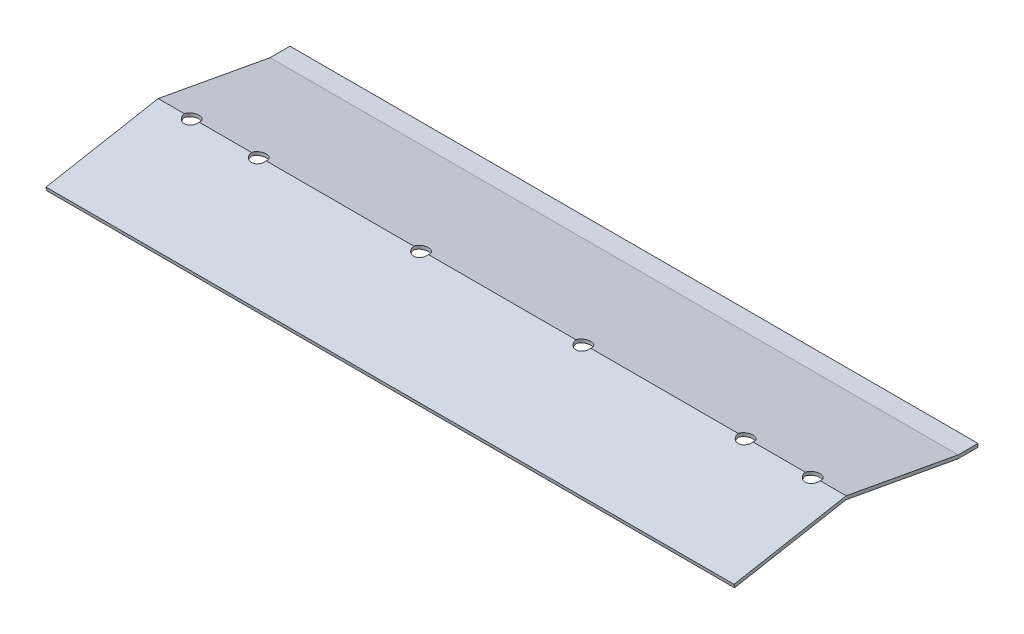
ISO-10303-21;
HEADER;
FILE_DESCRIPTION(('STEP AP214'),'2;1');
FILE_NAME('part.step','',(''),(''),'','','');
FILE_SCHEMA(('AUTOMOTIVE_DESIGN { 1 0 10303 214 1 1 1 1 }'));
ENDSEC;
DATA;
#1=APPLICATION_CONTEXT('core data for automotive mechanical design processes');
#2=APPLICATION_PROTOCOL_DEFINITION('international standard','automotive_design',2000,#1);
#3=PRODUCT_CONTEXT('',#1,'mechanical');
#4=PRODUCT('Part','Part','',(#3));
#5=PRODUCT_RELATED_PRODUCT_CATEGORY('part','',(#4));
#6=PRODUCT_DEFINITION_FORMATION('','',#4);
#7=PRODUCT_DEFINITION_CONTEXT('part definition',#1,'design');
#8=PRODUCT_DEFINITION('design','',#6,#7);
#9=PRODUCT_DEFINITION_SHAPE('','',#8);
#10=(LENGTH_UNIT() NAMED_UNIT(*) SI_UNIT(.MILLI.,.METRE.));
#11=(NAMED_UNIT(*) PLANE_ANGLE_UNIT() SI_UNIT($,.RADIAN.));
#12=(NAMED_UNIT(*) SI_UNIT($,.STERADIAN.) SOLID_ANGLE_UNIT());
#13=UNCERTAINTY_MEASURE_WITH_UNIT(LENGTH_MEASURE(1.E-05),#10,'distance_accuracy_value','');
#14=(GEOMETRIC_REPRESENTATION_CONTEXT(3) GLOBAL_UNCERTAINTY_ASSIGNED_CONTEXT((#13)) GLOBAL_UNIT_ASSIGNED_CONTEXT((#10,
#11,#12)) REPRESENTATION_CONTEXT('',''));
#15=CARTESIAN_POINT('',(0.,0.,0.));
#16=DIRECTION('',(0.,0.,1.));
#17=DIRECTION('',(1.,0.,0.));
#18=AXIS2_PLACEMENT_3D('',#15,#16,#17);
#19=CARTESIAN_POINT('',(1026.,-1243.62389600676,5648.33058655087));
#20=DIRECTION('',(0.,0.161662198391354,-0.986846154986315));
#21=DIRECTION('',(0.,0.986846154986315,0.161662198391354));
#22=AXIS2_PLACEMENT_3D('',#19,#20,#21);
#23=PLANE('',#22);
#24=DIRECTION('',(0.,-0.986846154986315,-0.161662198391354));
#25=VECTOR('',#24,1.);
#26=CARTESIAN_POINT('',(0.,-1243.62389600676,5648.33058655087));
#27=LINE('',#26,#25);
#28=CARTESIAN_POINT('',(0.,-1238.68966523183,5649.13889754283));
#29=VERTEX_POINT('',#28);
#30=CARTESIAN_POINT('',(0.,-1243.62389600676,5648.33058655087));
#31=VERTEX_POINT('',#30);
#32=EDGE_CURVE('E255',#29,#31,#27,.T.);
#33=ORIENTED_EDGE('',*,*,#32,.T.);
#34=DIRECTION('',(-1.,0.,0.));
#35=VECTOR('',#34,1.);
#36=CARTESIAN_POINT('',(1026.,-1243.62389600676,5648.33058655087));
#37=LINE('',#36,#35);
#38=CARTESIAN_POINT('',(1026.,-1243.62389600676,5648.33058655087));
#39=VERTEX_POINT('',#38);
#40=EDGE_CURVE('E178',#39,#31,#37,.T.);
#41=ORIENTED_EDGE('',*,*,#40,.F.);
#42=DIRECTION('',(0.,-0.986846154986315,-0.161662198391354));
#43=VECTOR('',#42,1.);
#44=CARTESIAN_POINT('',(1026.,-1243.62389600676,5648.33058655087));
#45=LINE('',#44,#43);
#46=CARTESIAN_POINT('',(1026.,-1238.68966523183,5649.13889754283));
#47=VERTEX_POINT('',#46);
#48=EDGE_CURVE('E270',#47,#39,#45,.T.);
#49=ORIENTED_EDGE('',*,*,#48,.F.);
#50=DIRECTION('',(-1.,0.,0.));
#51=VECTOR('',#50,1.);
#52=CARTESIAN_POINT('',(1026.,-1238.68966523183,5649.13889754283));
#53=LINE('',#52,#51);
#54=EDGE_CURVE('E203',#47,#29,#53,.T.);
#55=ORIENTED_EDGE('',*,*,#54,.T.);
#56=EDGE_LOOP('',(#33,#41,#49,#55));
#57=FACE_BOUND('',#56,.T.);
#58=ADVANCED_FACE('F33',(#57),#23,.F.);
#59=CARTESIAN_POINT('',(1026.,-1213.07202138308,5481.83058655087));
#60=DIRECTION('',(0.,0.983578386114327,0.180481462673418));
#61=DIRECTION('',(0.,-0.180481462673418,0.983578386114327));
#62=AXIS2_PLACEMENT_3D('',#59,#60,#61);
#63=PLANE('',#62);
#64=DIRECTION('',(-1.,0.,0.));
#65=VECTOR('',#64,1.);
#66=CARTESIAN_POINT('',(1026.,-1213.07202138308,5481.83058655087));
#67=LINE('',#66,#65);
#68=CARTESIAN_POINT('',(39.0000000000006,-1213.07202138308,5481.83058655087));
#69=VERTEX_POINT('',#68);
#70=CARTESIAN_POINT('',(0.,-1213.07202138308,5481.83058655087));
#71=VERTEX_POINT('',#70);
#72=EDGE_CURVE('E216',#69,#71,#67,.T.);
#73=ORIENTED_EDGE('',*,*,#72,.F.);
#74=CARTESIAN_POINT('',(50.,-1213.07202138308,5481.83058655087));
#75=DIRECTION('',(0.,0.983578386114327,0.180481462673418));
#76=DIRECTION('',(0.,0.180481462673418,-0.983578386114327));
#77=AXIS2_PLACEMENT_3D('',#74,#75,#76);
#78=ELLIPSE('',#77,11.1836536419389,10.9999999999999);
#79=CARTESIAN_POINT('',(61.0000000000004,-1213.07202138308,5481.83058655087));
#80=VERTEX_POINT('',#79);
#81=EDGE_CURVE('E46',#69,#80,#78,.T.);
#82=ORIENTED_EDGE('',*,*,#81,.T.);
#83=CARTESIAN_POINT('',(139.000000000001,-1213.07202138308,5481.83058655087));
#84=VERTEX_POINT('',#83);
#85=EDGE_CURVE('E363',#84,#80,#67,.T.);
#86=ORIENTED_EDGE('',*,*,#85,.F.);
#87=CARTESIAN_POINT('',(150.,-1213.07202138308,5481.83058655087));
#88=DIRECTION('',(0.,0.983578386114327,0.180481462673418));
#89=DIRECTION('',(0.,0.180481462673418,-0.983578386114327));
#90=AXIS2_PLACEMENT_3D('',#87,#88,#89);
#91=ELLIPSE('',#90,11.1836536419389,10.9999999999999);
#92=CARTESIAN_POINT('',(161.,-1213.07202138308,5481.83058655087));
#93=VERTEX_POINT('',#92);
#94=EDGE_CURVE('E53',#84,#93,#91,.T.);
#95=ORIENTED_EDGE('',*,*,#94,.T.);
#96=CARTESIAN_POINT('',(381.,-1213.07202138308,5481.83058655087));
#97=VERTEX_POINT('',#96);
#98=EDGE_CURVE('E361',#97,#93,#67,.T.);
#99=ORIENTED_EDGE('',*,*,#98,.F.);
#100=CARTESIAN_POINT('',(392.,-1213.07202138308,5481.83058655087));
#101=DIRECTION('',(0.,0.983578386114327,0.180481462673418));
#102=DIRECTION('',(0.,0.180481462673418,-0.983578386114327));
#103=AXIS2_PLACEMENT_3D('',#100,#101,#102);
#104=ELLIPSE('',#103,11.1836536419389,10.9999999999999);
#105=CARTESIAN_POINT('',(403.,-1213.07202138308,5481.83058655087));
#106=VERTEX_POINT('',#105);
#107=EDGE_CURVE('E323',#97,#106,#104,.T.);
#108=ORIENTED_EDGE('',*,*,#107,.T.);
#109=CARTESIAN_POINT('',(623.,-1213.07202138308,5481.83058655087));
#110=VERTEX_POINT('',#109);
#111=EDGE_CURVE('E357',#110,#106,#67,.T.);
#112=ORIENTED_EDGE('',*,*,#111,.F.);
#113=CARTESIAN_POINT('',(634.,-1213.07202138308,5481.83058655087));
#114=DIRECTION('',(0.,0.983578386114327,0.180481462673418));
#115=DIRECTION('',(0.,0.180481462673418,-0.983578386114327));
#116=AXIS2_PLACEMENT_3D('',#113,#114,#115);
#117=ELLIPSE('',#116,11.183653641939,11.);
#118=CARTESIAN_POINT('',(645.,-1213.07202138308,5481.83058655087));
#119=VERTEX_POINT('',#118);
#120=EDGE_CURVE('E350',#110,#119,#117,.T.);
#121=ORIENTED_EDGE('',*,*,#120,.T.);
#122=CARTESIAN_POINT('',(865.,-1213.07202138308,5481.83058655087));
#123=VERTEX_POINT('',#122);
#124=EDGE_CURVE('E359',#123,#119,#67,.T.);
#125=ORIENTED_EDGE('',*,*,#124,.F.);
#126=CARTESIAN_POINT('',(876.,-1213.07202138308,5481.83058655087));
#127=DIRECTION('',(0.,0.983578386114327,0.180481462673418));
#128=DIRECTION('',(0.,0.180481462673418,-0.983578386114327));
#129=AXIS2_PLACEMENT_3D('',#126,#127,#128);
#130=ELLIPSE('',#129,11.183653641939,11.);
#131=CARTESIAN_POINT('',(887.,-1213.07202138308,5481.83058655087));
#132=VERTEX_POINT('',#131);
#133=EDGE_CURVE('E342',#123,#132,#130,.T.);
#134=ORIENTED_EDGE('',*,*,#133,.T.);
#135=CARTESIAN_POINT('',(965.,-1213.07202138308,5481.83058655087));
#136=VERTEX_POINT('',#135);
#137=EDGE_CURVE('E220',#136,#132,#67,.T.);
#138=ORIENTED_EDGE('',*,*,#137,.F.);
#139=CARTESIAN_POINT('',(976.,-1213.07202138308,5481.83058655087));
#140=DIRECTION('',(0.,0.983578386114327,0.180481462673418));
#141=DIRECTION('',(0.,0.180481462673418,-0.983578386114327));
#142=AXIS2_PLACEMENT_3D('',#139,#140,#141);
#143=ELLIPSE('',#142,11.183653641939,11.);
#144=CARTESIAN_POINT('',(987.,-1213.07202138308,5481.83058655087));
#145=VERTEX_POINT('',#144);
#146=EDGE_CURVE('E336',#136,#145,#143,.T.);
#147=ORIENTED_EDGE('',*,*,#146,.T.);
#148=CARTESIAN_POINT('',(1026.,-1213.07202138308,5481.83058655087));
#149=VERTEX_POINT('',#148);
#150=EDGE_CURVE('E217',#149,#145,#67,.T.);
#151=ORIENTED_EDGE('',*,*,#150,.F.);
#152=DIRECTION('',(0.,0.180481462673418,-0.983578386114327));
#153=VECTOR('',#152,1.);
#154=CARTESIAN_POINT('',(1026.,-1213.07202138308,5481.83058655087));
#155=LINE('',#154,#153);
#156=EDGE_CURVE('E272',#39,#149,#155,.T.);
#157=ORIENTED_EDGE('',*,*,#156,.F.);
#158=ORIENTED_EDGE('',*,*,#40,.T.);
#159=DIRECTION('',(0.,0.180481462673418,-0.983578386114327));
#160=VECTOR('',#159,1.);
#161=CARTESIAN_POINT('',(0.,-1213.07202138308,5481.83058655087));
#162=LINE('',#161,#160);
#163=EDGE_CURVE('E257',#31,#71,#162,.T.);
#164=ORIENTED_EDGE('',*,*,#163,.T.);
#165=EDGE_LOOP('',(#73,#82,#86,#95,#99,#108,#112,#121,#125,#134,#138,#147,#151,#157,#158,#164));
#166=FACE_BOUND('',#165,.T.);
#167=ADVANCED_FACE('F300',(#166),#63,.F.);
#168=CARTESIAN_POINT('',(1026.,-1243.62389600676,5315.33058655087));
#169=DIRECTION('',(0.,0.983578386114327,-0.180481462673418));
#170=DIRECTION('',(0.,0.180481462673418,0.983578386114327));
#171=AXIS2_PLACEMENT_3D('',#168,#169,#170);
#172=PLANE('',#171);
#173=ORIENTED_EDGE('',*,*,#85,.T.);
#174=CARTESIAN_POINT('',(50.,-1213.07202138308,5481.83058655087));
#175=DIRECTION('',(0.,0.983578386114327,-0.180481462673418));
#176=DIRECTION('',(0.,0.180481462673418,0.983578386114327));
#177=AXIS2_PLACEMENT_3D('',#174,#175,#176);
#178=ELLIPSE('',#177,11.1836536419389,10.9999999999999);
#179=EDGE_CURVE('E322',#80,#69,#178,.T.);
#180=ORIENTED_EDGE('',*,*,#179,.T.);
#181=ORIENTED_EDGE('',*,*,#72,.T.);
#182=DIRECTION('',(0.,-0.180481462673418,-0.983578386114327));
#183=VECTOR('',#182,1.);
#184=CARTESIAN_POINT('',(0.,-1243.62389600676,5315.33058655087));
#185=LINE('',#184,#183);
#186=CARTESIAN_POINT('',(0.,-1243.62389600676,5315.33058655087));
#187=VERTEX_POINT('',#186);
#188=EDGE_CURVE('E260',#71,#187,#185,.T.);
#189=ORIENTED_EDGE('',*,*,#188,.T.);
#190=DIRECTION('',(-1.,0.,0.));
#191=VECTOR('',#190,1.);
#192=CARTESIAN_POINT('',(1026.,-1243.62389600676,5315.33058655087));
#193=LINE('',#192,#191);
#194=CARTESIAN_POINT('',(1026.,-1243.62389600676,5315.33058655087));
#195=VERTEX_POINT('',#194);
#196=EDGE_CURVE('E213',#195,#187,#193,.T.);
#197=ORIENTED_EDGE('',*,*,#196,.F.);
#198=DIRECTION('',(0.,-0.180481462673418,-0.983578386114327));
#199=VECTOR('',#198,1.);
#200=CARTESIAN_POINT('',(1026.,-1243.62389600676,5315.33058655087));
#201=LINE('',#200,#199);
#202=EDGE_CURVE('E275',#149,#195,#201,.T.);
#203=ORIENTED_EDGE('',*,*,#202,.F.);
#204=ORIENTED_EDGE('',*,*,#150,.T.);
#205=CARTESIAN_POINT('',(976.,-1213.07202138308,5481.83058655087));
#206=DIRECTION('',(0.,0.983578386114327,-0.180481462673418));
#207=DIRECTION('',(0.,0.180481462673418,0.983578386114327));
#208=AXIS2_PLACEMENT_3D('',#205,#206,#207);
#209=ELLIPSE('',#208,11.183653641939,11.);
#210=EDGE_CURVE('E338',#145,#136,#209,.T.);
#211=ORIENTED_EDGE('',*,*,#210,.T.);
#212=ORIENTED_EDGE('',*,*,#137,.T.);
#213=CARTESIAN_POINT('',(876.,-1213.07202138308,5481.83058655087));
#214=DIRECTION('',(0.,0.983578386114327,-0.180481462673418));
#215=DIRECTION('',(0.,0.180481462673418,0.983578386114327));
#216=AXIS2_PLACEMENT_3D('',#213,#214,#215);
#217=ELLIPSE('',#216,11.183653641939,11.);
#218=EDGE_CURVE('E345',#132,#123,#217,.T.);
#219=ORIENTED_EDGE('',*,*,#218,.T.);
#220=ORIENTED_EDGE('',*,*,#124,.T.);
#221=CARTESIAN_POINT('',(634.,-1213.07202138308,5481.83058655087));
#222=DIRECTION('',(0.,0.983578386114327,-0.180481462673418));
#223=DIRECTION('',(0.,0.180481462673418,0.983578386114327));
#224=AXIS2_PLACEMENT_3D('',#221,#222,#223);
#225=ELLIPSE('',#224,11.183653641939,11.);
#226=EDGE_CURVE('E188',#119,#110,#225,.T.);
#227=ORIENTED_EDGE('',*,*,#226,.T.);
#228=ORIENTED_EDGE('',*,*,#111,.T.);
#229=CARTESIAN_POINT('',(392.,-1213.07202138308,5481.83058655087));
#230=DIRECTION('',(0.,0.983578386114327,-0.180481462673418));
#231=DIRECTION('',(0.,0.180481462673418,0.983578386114327));
#232=AXIS2_PLACEMENT_3D('',#229,#230,#231);
#233=ELLIPSE('',#232,11.1836536419389,10.9999999999999);
#234=EDGE_CURVE('E326',#106,#97,#233,.T.);
#235=ORIENTED_EDGE('',*,*,#234,.T.);
#236=ORIENTED_EDGE('',*,*,#98,.T.);
#237=CARTESIAN_POINT('',(150.,-1213.07202138308,5481.83058655087));
#238=DIRECTION('',(0.,0.983578386114327,-0.180481462673418));
#239=DIRECTION('',(0.,0.180481462673418,0.983578386114327));
#240=AXIS2_PLACEMENT_3D('',#237,#238,#239);
#241=ELLIPSE('',#240,11.1836536419389,10.9999999999999);
#242=EDGE_CURVE('E333',#93,#84,#241,.T.);
#243=ORIENTED_EDGE('',*,*,#242,.T.);
#244=EDGE_LOOP('',(#173,#180,#181,#189,#197,#203,#204,#211,#212,#219,#220,#227,#228,#235,#236,#243));
#245=FACE_BOUND('',#244,.T.);
#246=ADVANCED_FACE('F310',(#245),#172,.F.);
#247=CARTESIAN_POINT('',(1026.,-1243.62389600676,5285.33058655087));
#248=DIRECTION('',(0.,1.,0.));
#249=DIRECTION('',(0.,0.,1.));
#250=AXIS2_PLACEMENT_3D('',#247,#248,#249);
#251=PLANE('',#250);
#252=DIRECTION('',(0.,0.,-1.));
#253=VECTOR('',#252,1.);
#254=CARTESIAN_POINT('',(0.,-1243.62389600676,5285.33058655087));
#255=LINE('',#254,#253);
#256=CARTESIAN_POINT('',(0.,-1243.62389600676,5285.33058655087));
#257=VERTEX_POINT('',#256);
#258=EDGE_CURVE('E262',#187,#257,#255,.T.);
#259=ORIENTED_EDGE('',*,*,#258,.T.);
#260=DIRECTION('',(-1.,0.,0.));
#261=VECTOR('',#260,1.);
#262=CARTESIAN_POINT('',(1026.,-1243.62389600676,5285.33058655087));
#263=LINE('',#262,#261);
#264=CARTESIAN_POINT('',(1026.,-1243.62389600676,5285.33058655087));
#265=VERTEX_POINT('',#264);
#266=EDGE_CURVE('E210',#265,#257,#263,.T.);
#267=ORIENTED_EDGE('',*,*,#266,.F.);
#268=DIRECTION('',(0.,0.,-1.));
#269=VECTOR('',#268,1.);
#270=CARTESIAN_POINT('',(1026.,-1243.62389600676,5285.33058655087));
#271=LINE('',#270,#269);
#272=EDGE_CURVE('E281',#195,#265,#271,.T.);
#273=ORIENTED_EDGE('',*,*,#272,.F.);
#274=ORIENTED_EDGE('',*,*,#196,.T.);
#275=EDGE_LOOP('',(#259,#267,#273,#274));
#276=FACE_BOUND('',#275,.T.);
#277=ADVANCED_FACE('F313',(#276),#251,.F.);
#278=CARTESIAN_POINT('',(1026.,-1238.62389600676,5285.33058655087));
#279=DIRECTION('',(0.,0.,1.));
#280=DIRECTION('',(1.,0.,0.));
#281=AXIS2_PLACEMENT_3D('',#278,#279,#280);
#282=PLANE('',#281);
#283=DIRECTION('',(0.,1.,0.));
#284=VECTOR('',#283,1.);
#285=CARTESIAN_POINT('',(0.,-1238.62389600676,5285.33058655087));
#286=LINE('',#285,#284);
#287=CARTESIAN_POINT('',(0.,-1238.62389600676,5285.33058655087));
#288=VERTEX_POINT('',#287);
#289=EDGE_CURVE('E264',#257,#288,#286,.T.);
#290=ORIENTED_EDGE('',*,*,#289,.T.);
#291=DIRECTION('',(-1.,0.,0.));
#292=VECTOR('',#291,1.);
#293=CARTESIAN_POINT('',(1026.,-1238.62389600676,5285.33058655087));
#294=LINE('',#293,#292);
#295=CARTESIAN_POINT('',(1026.,-1238.62389600676,5285.33058655087));
#296=VERTEX_POINT('',#295);
#297=EDGE_CURVE('E207',#296,#288,#294,.T.);
#298=ORIENTED_EDGE('',*,*,#297,.F.);
#299=DIRECTION('',(0.,1.,0.));
#300=VECTOR('',#299,1.);
#301=CARTESIAN_POINT('',(1026.,-1238.62389600676,5285.33058655087));
#302=LINE('',#301,#300);
#303=EDGE_CURVE('E283',#265,#296,#302,.T.);
#304=ORIENTED_EDGE('',*,*,#303,.F.);
#305=ORIENTED_EDGE('',*,*,#266,.T.);
#306=EDGE_LOOP('',(#290,#298,#304,#305));
#307=FACE_BOUND('',#306,.T.);
#308=ADVANCED_FACE('F316',(#307),#282,.F.);
#309=CARTESIAN_POINT('',(1026.,-1238.62389600676,5314.92375535766));
#310=DIRECTION('',(0.,-1.,0.));
#311=DIRECTION('',(0.,0.,-1.));
#312=AXIS2_PLACEMENT_3D('',#309,#310,#311);
#313=PLANE('',#312);
#314=DIRECTION('',(0.,0.,1.));
#315=VECTOR('',#314,1.);
#316=CARTESIAN_POINT('',(0.,-1238.62389600676,5314.92375535766));
#317=LINE('',#316,#315);
#318=CARTESIAN_POINT('',(0.,-1238.62389600676,5314.92375535766));
#319=VERTEX_POINT('',#318);
#320=EDGE_CURVE('E266',#288,#319,#317,.T.);
#321=ORIENTED_EDGE('',*,*,#320,.T.);
#322=DIRECTION('',(-1.,0.,0.));
#323=VECTOR('',#322,1.);
#324=CARTESIAN_POINT('',(1026.,-1238.62389600676,5314.92375535766));
#325=LINE('',#324,#323);
#326=CARTESIAN_POINT('',(1026.,-1238.62389600676,5314.92375535766));
#327=VERTEX_POINT('',#326);
#328=EDGE_CURVE('E201',#327,#319,#325,.T.);
#329=ORIENTED_EDGE('',*,*,#328,.F.);
#330=DIRECTION('',(0.,0.,1.));
#331=VECTOR('',#330,1.);
#332=CARTESIAN_POINT('',(1026.,-1238.62389600676,5314.92375535766));
#333=LINE('',#332,#331);
#334=EDGE_CURVE('E251',#296,#327,#333,.T.);
#335=ORIENTED_EDGE('',*,*,#334,.F.);
#336=ORIENTED_EDGE('',*,*,#297,.T.);
#337=EDGE_LOOP('',(#321,#329,#335,#336));
#338=FACE_BOUND('',#337,.T.);
#339=ADVANCED_FACE('F292',(#338),#313,.F.);
#340=CARTESIAN_POINT('',(1026.,-1208.00537550851,5481.83058655087));
#341=DIRECTION('',(0.,-0.983586759753724,0.180435822488691));
#342=DIRECTION('',(0.,-0.180435822488691,-0.983586759753724));
#343=AXIS2_PLACEMENT_3D('',#340,#341,#342);
#344=PLANE('',#343);
#345=DIRECTION('',(-1.,0.,0.));
#346=VECTOR('',#345,1.);
#347=CARTESIAN_POINT('',(1026.,-1208.00537550851,5481.83058655087));
#348=LINE('',#347,#346);
#349=CARTESIAN_POINT('',(39.0000000000001,-1208.00537550851,5481.83058655087));
#350=VERTEX_POINT('',#349);
#351=CARTESIAN_POINT('',(0.,-1208.00537550851,5481.83058655087));
#352=VERTEX_POINT('',#351);
#353=EDGE_CURVE('E202',#350,#352,#348,.T.);
#354=ORIENTED_EDGE('',*,*,#353,.F.);
#355=CARTESIAN_POINT('',(50.,-1208.00537550851,5481.83058655087));
#356=DIRECTION('',(0.,-0.983586759753724,0.180435822488691));
#357=DIRECTION('',(0.,0.180435822488691,0.983586759753724));
#358=AXIS2_PLACEMENT_3D('',#355,#356,#357);
#359=ELLIPSE('',#358,11.1835584313417,10.9999999999999);
#360=CARTESIAN_POINT('',(60.9999999999999,-1208.00537550851,5481.83058655087));
#361=VERTEX_POINT('',#360);
#362=EDGE_CURVE('E320',#350,#361,#359,.T.);
#363=ORIENTED_EDGE('',*,*,#362,.T.);
#364=CARTESIAN_POINT('',(139.,-1208.00537550851,5481.83058655087));
#365=VERTEX_POINT('',#364);
#366=EDGE_CURVE('E237',#365,#361,#348,.T.);
#367=ORIENTED_EDGE('',*,*,#366,.F.);
#368=CARTESIAN_POINT('',(150.,-1208.00537550851,5481.83058655087));
#369=DIRECTION('',(0.,-0.983586759753724,0.180435822488691));
#370=DIRECTION('',(0.,0.180435822488691,0.983586759753724));
#371=AXIS2_PLACEMENT_3D('',#368,#369,#370);
#372=ELLIPSE('',#371,11.1835584313418,10.9999999999999);
#373=CARTESIAN_POINT('',(161.,-1208.00537550851,5481.83058655087));
#374=VERTEX_POINT('',#373);
#375=EDGE_CURVE('E236',#365,#374,#372,.T.);
#376=ORIENTED_EDGE('',*,*,#375,.T.);
#377=CARTESIAN_POINT('',(381.,-1208.00537550851,5481.83058655087));
#378=VERTEX_POINT('',#377);
#379=EDGE_CURVE('E197',#378,#374,#348,.T.);
#380=ORIENTED_EDGE('',*,*,#379,.F.);
#381=CARTESIAN_POINT('',(392.,-1208.00537550851,5481.83058655087));
#382=DIRECTION('',(0.,-0.983586759753724,0.180435822488691));
#383=DIRECTION('',(0.,0.180435822488691,0.983586759753724));
#384=AXIS2_PLACEMENT_3D('',#381,#382,#383);
#385=ELLIPSE('',#384,11.1835584313418,10.9999999999999);
#386=CARTESIAN_POINT('',(403.,-1208.00537550851,5481.83058655087));
#387=VERTEX_POINT('',#386);
#388=EDGE_CURVE('E234',#378,#387,#385,.T.);
#389=ORIENTED_EDGE('',*,*,#388,.T.);
#390=CARTESIAN_POINT('',(623.,-1208.00537550851,5481.83058655087));
#391=VERTEX_POINT('',#390);
#392=EDGE_CURVE('E187',#391,#387,#348,.T.);
#393=ORIENTED_EDGE('',*,*,#392,.F.);
#394=CARTESIAN_POINT('',(634.,-1208.00537550851,5481.83058655087));
#395=DIRECTION('',(0.,-0.983586759753724,0.180435822488691));
#396=DIRECTION('',(0.,0.180435822488691,0.983586759753724));
#397=AXIS2_PLACEMENT_3D('',#394,#395,#396);
#398=ELLIPSE('',#397,11.1835584313419,11.);
#399=CARTESIAN_POINT('',(645.,-1208.00537550851,5481.83058655087));
#400=VERTEX_POINT('',#399);
#401=EDGE_CURVE('E172',#391,#400,#398,.T.);
#402=ORIENTED_EDGE('',*,*,#401,.T.);
#403=CARTESIAN_POINT('',(865.,-1208.00537550851,5481.83058655087));
#404=VERTEX_POINT('',#403);
#405=EDGE_CURVE('E185',#404,#400,#348,.T.);
#406=ORIENTED_EDGE('',*,*,#405,.F.);
#407=CARTESIAN_POINT('',(876.,-1208.00537550851,5481.83058655087));
#408=DIRECTION('',(0.,-0.983586759753724,0.180435822488691));
#409=DIRECTION('',(0.,0.180435822488691,0.983586759753724));
#410=AXIS2_PLACEMENT_3D('',#407,#408,#409);
#411=ELLIPSE('',#410,11.1835584313419,11.);
#412=CARTESIAN_POINT('',(887.,-1208.00537550851,5481.83058655087));
#413=VERTEX_POINT('',#412);
#414=EDGE_CURVE('E348',#404,#413,#411,.T.);
#415=ORIENTED_EDGE('',*,*,#414,.T.);
#416=CARTESIAN_POINT('',(965.,-1208.00537550851,5481.83058655087));
#417=VERTEX_POINT('',#416);
#418=EDGE_CURVE('E194',#417,#413,#348,.T.);
#419=ORIENTED_EDGE('',*,*,#418,.F.);
#420=CARTESIAN_POINT('',(976.,-1208.00537550851,5481.83058655087));
#421=DIRECTION('',(0.,-0.983586759753724,0.180435822488691));
#422=DIRECTION('',(0.,0.180435822488691,0.983586759753724));
#423=AXIS2_PLACEMENT_3D('',#420,#421,#422);
#424=ELLIPSE('',#423,11.1835584313419,11.);
#425=CARTESIAN_POINT('',(987.,-1208.00537550851,5481.83058655087));
#426=VERTEX_POINT('',#425);
#427=EDGE_CURVE('E297',#417,#426,#424,.T.);
#428=ORIENTED_EDGE('',*,*,#427,.T.);
#429=CARTESIAN_POINT('',(1026.,-1208.00537550851,5481.83058655087));
#430=VERTEX_POINT('',#429);
#431=EDGE_CURVE('E196',#430,#426,#348,.T.);
#432=ORIENTED_EDGE('',*,*,#431,.F.);
#433=DIRECTION('',(0.,0.180435822488691,0.983586759753724));
#434=VECTOR('',#433,1.);
#435=CARTESIAN_POINT('',(1026.,-1208.00537550851,5481.83058655087));
#436=LINE('',#435,#434);
#437=EDGE_CURVE('E246',#327,#430,#436,.T.);
#438=ORIENTED_EDGE('',*,*,#437,.F.);
#439=ORIENTED_EDGE('',*,*,#328,.T.);
#440=DIRECTION('',(0.,0.180435822488691,0.983586759753724));
#441=VECTOR('',#440,1.);
#442=CARTESIAN_POINT('',(0.,-1208.00537550851,5481.83058655087));
#443=LINE('',#442,#441);
#444=EDGE_CURVE('E268',#319,#352,#443,.T.);
#445=ORIENTED_EDGE('',*,*,#444,.T.);
#446=EDGE_LOOP('',(#354,#363,#367,#376,#380,#389,#393,#402,#406,#415,#419,#428,#432,#438,#439,#445));
#447=FACE_BOUND('',#446,.T.);
#448=ADVANCED_FACE('F183',(#447),#344,.F.);
#449=CARTESIAN_POINT('',(1026.,-1238.68966523183,5649.13889754283));
#450=DIRECTION('',(0.,-0.983594981401914,-0.180390999112952));
#451=DIRECTION('',(0.,0.180390999112952,-0.983594981401914));
#452=AXIS2_PLACEMENT_3D('',#449,#450,#451);
#453=PLANE('',#452);
#454=ORIENTED_EDGE('',*,*,#366,.T.);
#455=CARTESIAN_POINT('',(50.,-1208.00537550851,5481.83058655087));
#456=DIRECTION('',(0.,-0.983594981401914,-0.180390999112952));
#457=DIRECTION('',(0.,0.180390999112952,-0.983594981401914));
#458=AXIS2_PLACEMENT_3D('',#455,#456,#457);
#459=ELLIPSE('',#458,11.1834649505039,10.9999999999999);
#460=EDGE_CURVE('E11',#361,#350,#459,.T.);
#461=ORIENTED_EDGE('',*,*,#460,.T.);
#462=ORIENTED_EDGE('',*,*,#353,.T.);
#463=DIRECTION('',(0.,-0.180390999112952,0.983594981401914));
#464=VECTOR('',#463,1.);
#465=CARTESIAN_POINT('',(0.,-1238.68966523183,5649.13889754283));
#466=LINE('',#465,#464);
#467=EDGE_CURVE('E269',#352,#29,#466,.T.);
#468=ORIENTED_EDGE('',*,*,#467,.T.);
#469=ORIENTED_EDGE('',*,*,#54,.F.);
#470=DIRECTION('',(0.,-0.180390999112952,0.983594981401914));
#471=VECTOR('',#470,1.);
#472=CARTESIAN_POINT('',(1026.,-1238.68966523183,5649.13889754283));
#473=LINE('',#472,#471);
#474=EDGE_CURVE('E240',#430,#47,#473,.T.);
#475=ORIENTED_EDGE('',*,*,#474,.F.);
#476=ORIENTED_EDGE('',*,*,#431,.T.);
#477=CARTESIAN_POINT('',(976.,-1208.00537550851,5481.83058655087));
#478=DIRECTION('',(0.,-0.983594981401914,-0.180390999112952));
#479=DIRECTION('',(0.,0.180390999112952,-0.983594981401914));
#480=AXIS2_PLACEMENT_3D('',#477,#478,#479);
#481=ELLIPSE('',#480,11.183464950504,11.);
#482=EDGE_CURVE('E224',#426,#417,#481,.T.);
#483=ORIENTED_EDGE('',*,*,#482,.T.);
#484=ORIENTED_EDGE('',*,*,#418,.T.);
#485=CARTESIAN_POINT('',(876.,-1208.00537550851,5481.83058655087));
#486=DIRECTION('',(0.,-0.983594981401914,-0.180390999112952));
#487=DIRECTION('',(0.,0.180390999112952,-0.983594981401914));
#488=AXIS2_PLACEMENT_3D('',#485,#486,#487);
#489=ELLIPSE('',#488,11.183464950504,11.);
#490=EDGE_CURVE('E177',#413,#404,#489,.T.);
#491=ORIENTED_EDGE('',*,*,#490,.T.);
#492=ORIENTED_EDGE('',*,*,#405,.T.);
#493=CARTESIAN_POINT('',(634.,-1208.00537550851,5481.83058655087));
#494=DIRECTION('',(0.,-0.983594981401914,-0.180390999112952));
#495=DIRECTION('',(0.,0.180390999112952,-0.983594981401914));
#496=AXIS2_PLACEMENT_3D('',#493,#494,#495);
#497=ELLIPSE('',#496,11.183464950504,11.);
#498=EDGE_CURVE('E168',#400,#391,#497,.T.);
#499=ORIENTED_EDGE('',*,*,#498,.T.);
#500=ORIENTED_EDGE('',*,*,#392,.T.);
#501=CARTESIAN_POINT('',(392.,-1208.00537550851,5481.83058655087));
#502=DIRECTION('',(0.,-0.983594981401914,-0.180390999112952));
#503=DIRECTION('',(0.,0.180390999112952,-0.983594981401914));
#504=AXIS2_PLACEMENT_3D('',#501,#502,#503);
#505=ELLIPSE('',#504,11.183464950504,10.9999999999999);
#506=EDGE_CURVE('E40',#387,#378,#505,.T.);
#507=ORIENTED_EDGE('',*,*,#506,.T.);
#508=ORIENTED_EDGE('',*,*,#379,.T.);
#509=CARTESIAN_POINT('',(150.,-1208.00537550851,5481.83058655087));
#510=DIRECTION('',(0.,-0.983594981401914,-0.180390999112952));
#511=DIRECTION('',(0.,0.180390999112952,-0.983594981401914));
#512=AXIS2_PLACEMENT_3D('',#509,#510,#511);
#513=ELLIPSE('',#512,11.183464950504,10.9999999999999);
#514=EDGE_CURVE('E227',#374,#365,#513,.T.);
#515=ORIENTED_EDGE('',*,*,#514,.T.);
#516=EDGE_LOOP('',(#454,#461,#462,#468,#469,#475,#476,#483,#484,#491,#492,#499,#500,#507,#508,#515));
#517=FACE_BOUND('',#516,.T.);
#518=ADVANCED_FACE('F192',(#517),#453,.F.);
#519=CARTESIAN_POINT('',(1026.,0.,0.));
#520=DIRECTION('',(-1.,0.,0.));
#521=DIRECTION('',(0.,0.,1.));
#522=AXIS2_PLACEMENT_3D('',#519,#520,#521);
#523=PLANE('',#522);
#524=ORIENTED_EDGE('',*,*,#48,.T.);
#525=ORIENTED_EDGE('',*,*,#156,.T.);
#526=ORIENTED_EDGE('',*,*,#202,.T.);
#527=ORIENTED_EDGE('',*,*,#272,.T.);
#528=ORIENTED_EDGE('',*,*,#303,.T.);
#529=ORIENTED_EDGE('',*,*,#334,.T.);
#530=ORIENTED_EDGE('',*,*,#437,.T.);
#531=ORIENTED_EDGE('',*,*,#474,.T.);
#532=EDGE_LOOP('',(#524,#525,#526,#527,#528,#529,#530,#531));
#533=FACE_BOUND('',#532,.T.);
#534=ADVANCED_FACE('F286',(#533),#523,.F.);
#535=CARTESIAN_POINT('',(0.,0.,0.));
#536=DIRECTION('',(-1.,0.,0.));
#537=DIRECTION('',(0.,0.,1.));
#538=AXIS2_PLACEMENT_3D('',#535,#536,#537);
#539=PLANE('',#538);
#540=ORIENTED_EDGE('',*,*,#32,.F.);
#541=ORIENTED_EDGE('',*,*,#467,.F.);
#542=ORIENTED_EDGE('',*,*,#444,.F.);
#543=ORIENTED_EDGE('',*,*,#320,.F.);
#544=ORIENTED_EDGE('',*,*,#289,.F.);
#545=ORIENTED_EDGE('',*,*,#258,.F.);
#546=ORIENTED_EDGE('',*,*,#188,.F.);
#547=ORIENTED_EDGE('',*,*,#163,.F.);
#548=EDGE_LOOP('',(#540,#541,#542,#543,#544,#545,#546,#547));
#549=FACE_BOUND('',#548,.T.);
#550=ADVANCED_FACE('F318',(#549),#539,.T.);
#551=CARTESIAN_POINT('',(634.,-1243.62389600676,5481.83058655087));
#552=DIRECTION('',(0.,1.,0.));
#553=DIRECTION('',(0.,0.,1.));
#554=AXIS2_PLACEMENT_3D('',#551,#552,#553);
#555=CYLINDRICAL_SURFACE('',#554,11.);
#556=ORIENTED_EDGE('',*,*,#498,.F.);
#557=ORIENTED_EDGE('',*,*,#401,.F.);
#558=EDGE_LOOP('',(#556,#557));
#559=FACE_BOUND('',#558,.T.);
#560=ORIENTED_EDGE('',*,*,#226,.F.);
#561=ORIENTED_EDGE('',*,*,#120,.F.);
#562=EDGE_LOOP('',(#560,#561));
#563=FACE_BOUND('',#562,.T.);
#564=ADVANCED_FACE('F170',(#559,#563),#555,.F.);
#565=CARTESIAN_POINT('',(876.,-1243.62389600676,5481.83058655087));
#566=DIRECTION('',(0.,1.,0.));
#567=DIRECTION('',(0.,0.,1.));
#568=AXIS2_PLACEMENT_3D('',#565,#566,#567);
#569=CYLINDRICAL_SURFACE('',#568,11.);
#570=ORIENTED_EDGE('',*,*,#490,.F.);
#571=ORIENTED_EDGE('',*,*,#414,.F.);
#572=EDGE_LOOP('',(#570,#571));
#573=FACE_BOUND('',#572,.T.);
#574=ORIENTED_EDGE('',*,*,#218,.F.);
#575=ORIENTED_EDGE('',*,*,#133,.F.);
#576=EDGE_LOOP('',(#574,#575));
#577=FACE_BOUND('',#576,.T.);
#578=ADVANCED_FACE('F401',(#573,#577),#569,.F.);
#579=CARTESIAN_POINT('',(976.,-1243.62389600676,5481.83058655087));
#580=DIRECTION('',(0.,1.,0.));
#581=DIRECTION('',(0.,0.,1.));
#582=AXIS2_PLACEMENT_3D('',#579,#580,#581);
#583=CYLINDRICAL_SURFACE('',#582,11.);
#584=ORIENTED_EDGE('',*,*,#482,.F.);
#585=ORIENTED_EDGE('',*,*,#427,.F.);
#586=EDGE_LOOP('',(#584,#585));
#587=FACE_BOUND('',#586,.T.);
#588=ORIENTED_EDGE('',*,*,#210,.F.);
#589=ORIENTED_EDGE('',*,*,#146,.F.);
#590=EDGE_LOOP('',(#588,#589));
#591=FACE_BOUND('',#590,.T.);
#592=ADVANCED_FACE('F398',(#587,#591),#583,.F.);
#593=CARTESIAN_POINT('',(150.,-1243.62389600676,5481.83058655087));
#594=DIRECTION('',(0.,1.,0.));
#595=DIRECTION('',(0.,0.,1.));
#596=AXIS2_PLACEMENT_3D('',#593,#594,#595);
#597=CYLINDRICAL_SURFACE('',#596,10.9999999999999);
#598=ORIENTED_EDGE('',*,*,#514,.F.);
#599=ORIENTED_EDGE('',*,*,#375,.F.);
#600=EDGE_LOOP('',(#598,#599));
#601=FACE_BOUND('',#600,.T.);
#602=ORIENTED_EDGE('',*,*,#242,.F.);
#603=ORIENTED_EDGE('',*,*,#94,.F.);
#604=EDGE_LOOP('',(#602,#603));
#605=FACE_BOUND('',#604,.T.);
#606=ADVANCED_FACE('F372',(#601,#605),#597,.F.);
#607=CARTESIAN_POINT('',(392.,-1243.62389600676,5481.83058655087));
#608=DIRECTION('',(0.,1.,0.));
#609=DIRECTION('',(0.,0.,1.));
#610=AXIS2_PLACEMENT_3D('',#607,#608,#609);
#611=CYLINDRICAL_SURFACE('',#610,10.9999999999999);
#612=ORIENTED_EDGE('',*,*,#506,.F.);
#613=ORIENTED_EDGE('',*,*,#388,.F.);
#614=EDGE_LOOP('',(#612,#613));
#615=FACE_BOUND('',#614,.T.);
#616=ORIENTED_EDGE('',*,*,#234,.F.);
#617=ORIENTED_EDGE('',*,*,#107,.F.);
#618=EDGE_LOOP('',(#616,#617));
#619=FACE_BOUND('',#618,.T.);
#620=ADVANCED_FACE('F367',(#615,#619),#611,.F.);
#621=CARTESIAN_POINT('',(50.,-1243.62389600676,5481.83058655087));
#622=DIRECTION('',(0.,1.,0.));
#623=DIRECTION('',(0.,0.,1.));
#624=AXIS2_PLACEMENT_3D('',#621,#622,#623);
#625=CYLINDRICAL_SURFACE('',#624,10.9999999999999);
#626=ORIENTED_EDGE('',*,*,#460,.F.);
#627=ORIENTED_EDGE('',*,*,#362,.F.);
#628=EDGE_LOOP('',(#626,#627));
#629=FACE_BOUND('',#628,.T.);
#630=ORIENTED_EDGE('',*,*,#179,.F.);
#631=ORIENTED_EDGE('',*,*,#81,.F.);
#632=EDGE_LOOP('',(#630,#631));
#633=FACE_BOUND('',#632,.T.);
#634=ADVANCED_FACE('F365',(#629,#633),#625,.F.);
#635=CLOSED_SHELL('',(#58,#167,#246,#277,#308,#339,#448,#518,#534,#550,#564,#578,#592,#606,#620,#634));
#636=MANIFOLD_SOLID_BREP('B2',#635);
#637=ADVANCED_BREP_SHAPE_REPRESENTATION('',(#18,#636),#14);
#638=SHAPE_DEFINITION_REPRESENTATION(#9,#637);
ENDSEC;
END-ISO-10303-21;
